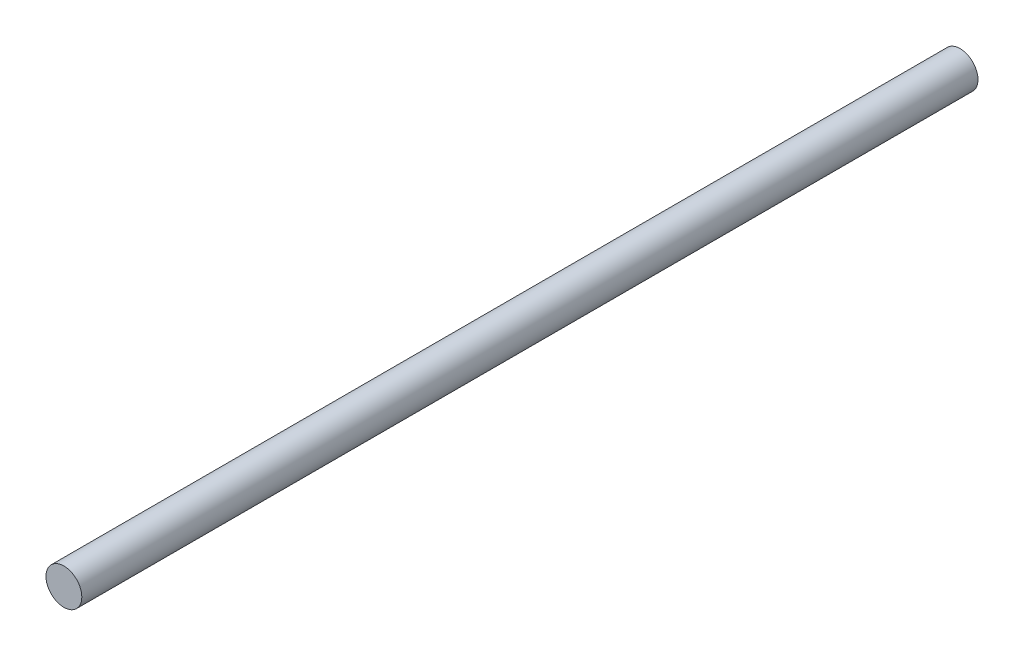
ISO-10303-21;
HEADER;
FILE_DESCRIPTION(('STEP AP214'),'2;1');
FILE_NAME('part.step','',(''),(''),'','','');
FILE_SCHEMA(('AUTOMOTIVE_DESIGN { 1 0 10303 214 1 1 1 1 }'));
ENDSEC;
DATA;
#1=APPLICATION_CONTEXT('core data for automotive mechanical design processes');
#2=APPLICATION_PROTOCOL_DEFINITION('international standard','automotive_design',2000,#1);
#3=PRODUCT_CONTEXT('',#1,'mechanical');
#4=PRODUCT('Part','Part','',(#3));
#5=PRODUCT_RELATED_PRODUCT_CATEGORY('part','',(#4));
#6=PRODUCT_DEFINITION_FORMATION('','',#4);
#7=PRODUCT_DEFINITION_CONTEXT('part definition',#1,'design');
#8=PRODUCT_DEFINITION('design','',#6,#7);
#9=PRODUCT_DEFINITION_SHAPE('','',#8);
#10=(LENGTH_UNIT() NAMED_UNIT(*) SI_UNIT(.MILLI.,.METRE.));
#11=(NAMED_UNIT(*) PLANE_ANGLE_UNIT() SI_UNIT($,.RADIAN.));
#12=(NAMED_UNIT(*) SI_UNIT($,.STERADIAN.) SOLID_ANGLE_UNIT());
#13=UNCERTAINTY_MEASURE_WITH_UNIT(LENGTH_MEASURE(1.E-05),#10,'distance_accuracy_value','');
#14=(GEOMETRIC_REPRESENTATION_CONTEXT(3) GLOBAL_UNCERTAINTY_ASSIGNED_CONTEXT((#13)) GLOBAL_UNIT_ASSIGNED_CONTEXT((#10,
#11,#12)) REPRESENTATION_CONTEXT('',''));
#15=CARTESIAN_POINT('',(0.,0.,0.));
#16=DIRECTION('',(0.,0.,1.));
#17=DIRECTION('',(1.,0.,0.));
#18=AXIS2_PLACEMENT_3D('',#15,#16,#17);
#19=CARTESIAN_POINT('',(0.,0.,150.));
#20=DIRECTION('',(0.,0.,-1.));
#21=DIRECTION('',(-1.,0.,0.));
#22=AXIS2_PLACEMENT_3D('',#19,#20,#21);
#23=CYLINDRICAL_SURFACE('',#22,3.);
#24=CARTESIAN_POINT('',(0.,0.,150.));
#25=DIRECTION('',(0.,0.,1.));
#26=DIRECTION('',(1.,0.,0.));
#27=AXIS2_PLACEMENT_3D('',#24,#25,#26);
#28=CIRCLE('',#27,3.);
#29=CARTESIAN_POINT('',(3.,0.,150.));
#30=VERTEX_POINT('',#29);
#31=EDGE_CURVE('E10',#30,#30,#28,.T.);
#32=ORIENTED_EDGE('',*,*,#31,.F.);
#33=EDGE_LOOP('',(#32));
#34=FACE_BOUND('',#33,.T.);
#35=CARTESIAN_POINT('',(0.,0.,0.));
#36=DIRECTION('',(0.,0.,1.));
#37=DIRECTION('',(1.,0.,0.));
#38=AXIS2_PLACEMENT_3D('',#35,#36,#37);
#39=CIRCLE('',#38,3.);
#40=CARTESIAN_POINT('',(3.,0.,0.));
#41=VERTEX_POINT('',#40);
#42=EDGE_CURVE('E38',#41,#41,#39,.T.);
#43=ORIENTED_EDGE('',*,*,#42,.T.);
#44=EDGE_LOOP('',(#43));
#45=FACE_BOUND('',#44,.T.);
#46=ADVANCED_FACE('F35',(#34,#45),#23,.T.);
#47=CARTESIAN_POINT('',(0.,0.,150.));
#48=DIRECTION('',(0.,0.,1.));
#49=DIRECTION('',(1.,0.,0.));
#50=AXIS2_PLACEMENT_3D('',#47,#48,#49);
#51=PLANE('',#50);
#52=ORIENTED_EDGE('',*,*,#31,.T.);
#53=EDGE_LOOP('',(#52));
#54=FACE_BOUND('',#53,.T.);
#55=ADVANCED_FACE('F50',(#54),#51,.T.);
#56=CARTESIAN_POINT('',(0.,0.,0.));
#57=DIRECTION('',(0.,0.,1.));
#58=DIRECTION('',(1.,0.,0.));
#59=AXIS2_PLACEMENT_3D('',#56,#57,#58);
#60=PLANE('',#59);
#61=ORIENTED_EDGE('',*,*,#42,.F.);
#62=EDGE_LOOP('',(#61));
#63=FACE_BOUND('',#62,.T.);
#64=ADVANCED_FACE('F48',(#63),#60,.F.);
#65=CLOSED_SHELL('',(#46,#55,#64));
#66=MANIFOLD_SOLID_BREP('B2',#65);
#67=ADVANCED_BREP_SHAPE_REPRESENTATION('',(#18,#66),#14);
#68=SHAPE_DEFINITION_REPRESENTATION(#9,#67);
ENDSEC;
END-ISO-10303-21;
